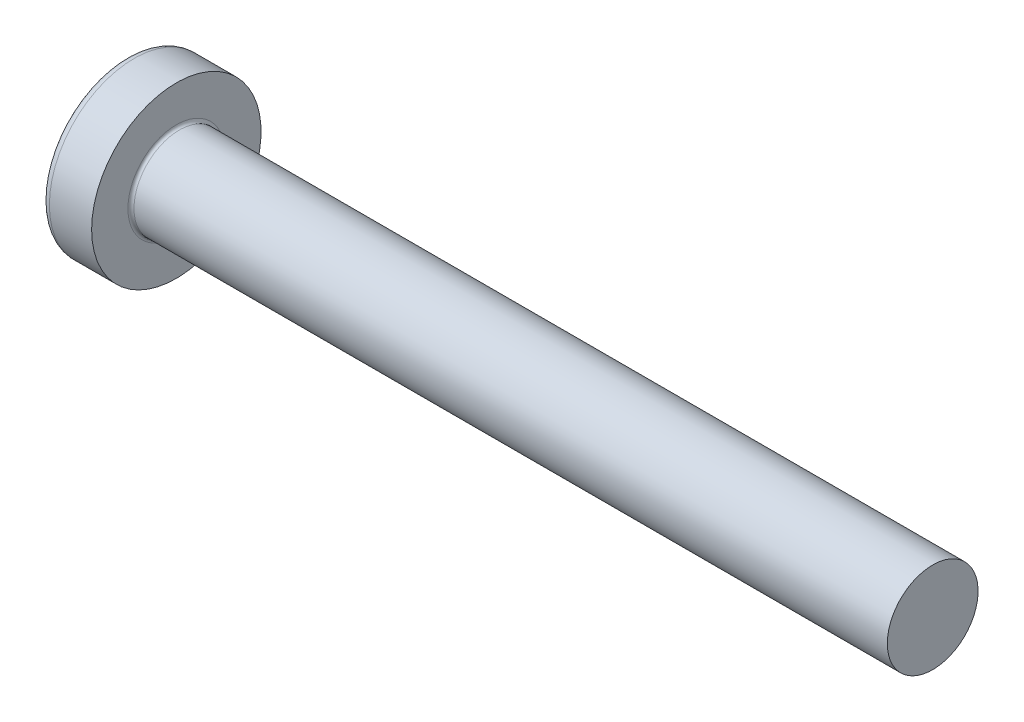
ISO-10303-21;
HEADER;
FILE_DESCRIPTION(('STEP AP214'),'2;1');
FILE_NAME('part.step','',(''),(''),'','','');
FILE_SCHEMA(('AUTOMOTIVE_DESIGN { 1 0 10303 214 1 1 1 1 }'));
ENDSEC;
DATA;
#1=APPLICATION_CONTEXT('core data for automotive mechanical design processes');
#2=APPLICATION_PROTOCOL_DEFINITION('international standard','automotive_design',2000,#1);
#3=PRODUCT_CONTEXT('',#1,'mechanical');
#4=PRODUCT('Part','Part','',(#3));
#5=PRODUCT_RELATED_PRODUCT_CATEGORY('part','',(#4));
#6=PRODUCT_DEFINITION_FORMATION('','',#4);
#7=PRODUCT_DEFINITION_CONTEXT('part definition',#1,'design');
#8=PRODUCT_DEFINITION('design','',#6,#7);
#9=PRODUCT_DEFINITION_SHAPE('','',#8);
#10=(LENGTH_UNIT() NAMED_UNIT(*) SI_UNIT(.MILLI.,.METRE.));
#11=(NAMED_UNIT(*) PLANE_ANGLE_UNIT() SI_UNIT($,.RADIAN.));
#12=(NAMED_UNIT(*) SI_UNIT($,.STERADIAN.) SOLID_ANGLE_UNIT());
#13=UNCERTAINTY_MEASURE_WITH_UNIT(LENGTH_MEASURE(1.E-05),#10,'distance_accuracy_value','');
#14=(GEOMETRIC_REPRESENTATION_CONTEXT(3) GLOBAL_UNCERTAINTY_ASSIGNED_CONTEXT((#13)) GLOBAL_UNIT_ASSIGNED_CONTEXT((#10,
#11,#12)) REPRESENTATION_CONTEXT('',''));
#15=CARTESIAN_POINT('',(0.,0.,0.));
#16=DIRECTION('',(0.,0.,1.));
#17=DIRECTION('',(1.,0.,0.));
#18=AXIS2_PLACEMENT_3D('',#15,#16,#17);
#19=CARTESIAN_POINT('',(5.,0.,0.));
#20=DIRECTION('',(-1.,0.,0.));
#21=DIRECTION('',(0.,1.,0.));
#22=AXIS2_PLACEMENT_3D('',#19,#20,#21);
#23=SPHERICAL_SURFACE('',#22,5.);
#24=CARTESIAN_POINT('',(0.775371598933733,0.,0.));
#25=DIRECTION('',(-1.,0.,0.));
#26=DIRECTION('',(0.,0.,1.));
#27=AXIS2_PLACEMENT_3D('',#24,#25,#26);
#28=CIRCLE('',#27,2.67441860465116);
#29=CARTESIAN_POINT('',(0.775371598933733,0.,2.67441860465116));
#30=VERTEX_POINT('',#29);
#31=EDGE_CURVE('E238',#30,#30,#28,.T.);
#32=ORIENTED_EDGE('',*,*,#31,.T.);
#33=EDGE_LOOP('',(#32));
#34=FACE_BOUND('',#33,.T.);
#35=CARTESIAN_POINT('',(0.0457951200896417,0.,0.));
#36=DIRECTION('',(1.,0.,0.));
#37=DIRECTION('',(0.,0.,-1.));
#38=AXIS2_PLACEMENT_3D('',#35,#36,#37);
#39=CIRCLE('',#38,0.675169614150692);
#40=CARTESIAN_POINT('',(0.0457951200896426,-0.369999999999997,-0.564760133040919));
#41=VERTEX_POINT('',#40);
#42=CARTESIAN_POINT('',(0.0457951200896417,-0.564760133040924,-0.37));
#43=VERTEX_POINT('',#42);
#44=EDGE_CURVE('E374',#41,#43,#39,.F.);
#45=ORIENTED_EDGE('',*,*,#44,.F.);
#46=CARTESIAN_POINT('',(5.,-0.370000000000002,0.));
#47=DIRECTION('',(0.,1.,0.));
#48=DIRECTION('',(0.,0.,1.));
#49=AXIS2_PLACEMENT_3D('',#46,#47,#48);
#50=CIRCLE('',#49,4.98629120689917);
#51=CARTESIAN_POINT('',(0.18786973422864,-0.369999999999995,-1.30633162146802));
#52=VERTEX_POINT('',#51);
#53=EDGE_CURVE('E300',#52,#41,#50,.T.);
#54=ORIENTED_EDGE('',*,*,#53,.F.);
#55=CARTESIAN_POINT('',(4.56358262530798,0.,0.87531798330592));
#56=DIRECTION('',(0.446197753347436,0.,-0.894934391398442));
#57=DIRECTION('',(-0.894934391398442,0.,-0.446197753347436));
#58=AXIS2_PLACEMENT_3D('',#55,#56,#57);
#59=CIRCLE('',#58,4.90340272700175);
#60=CARTESIAN_POINT('',(0.187869734228641,0.370000000000005,-1.30633162146802));
#61=VERTEX_POINT('',#60);
#62=EDGE_CURVE('E272',#52,#61,#59,.T.);
#63=ORIENTED_EDGE('',*,*,#62,.T.);
#64=CARTESIAN_POINT('',(5.,0.369999999999999,0.));
#65=DIRECTION('',(0.,-1.,0.));
#66=DIRECTION('',(0.,0.,-1.));
#67=AXIS2_PLACEMENT_3D('',#64,#65,#66);
#68=CIRCLE('',#67,4.98629120689917);
#69=CARTESIAN_POINT('',(0.0457951200896424,0.370000000000002,-0.564760133040916));
#70=VERTEX_POINT('',#69);
#71=EDGE_CURVE('E327',#70,#61,#68,.T.);
#72=ORIENTED_EDGE('',*,*,#71,.F.);
#73=CARTESIAN_POINT('',(0.0457951200896417,0.564760133040913,-0.37));
#74=VERTEX_POINT('',#73);
#75=EDGE_CURVE('E393',#74,#70,#39,.F.);
#76=ORIENTED_EDGE('',*,*,#75,.F.);
#77=CARTESIAN_POINT('',(5.,0.,-0.369999999999999));
#78=DIRECTION('',(0.,0.,1.));
#79=DIRECTION('',(1.,0.,0.));
#80=AXIS2_PLACEMENT_3D('',#77,#78,#79);
#81=CIRCLE('',#80,4.98629120689917);
#82=CARTESIAN_POINT('',(0.187869734228642,1.30633162146802,-0.37));
#83=VERTEX_POINT('',#82);
#84=EDGE_CURVE('E266',#83,#74,#81,.T.);
#85=ORIENTED_EDGE('',*,*,#84,.F.);
#86=CARTESIAN_POINT('',(4.56358262530798,-0.87531798330592,0.));
#87=DIRECTION('',(0.446197753347436,0.894934391398443,0.));
#88=DIRECTION('',(-0.894934391398443,0.446197753347436,0.));
#89=AXIS2_PLACEMENT_3D('',#86,#87,#88);
#90=CIRCLE('',#89,4.90340272700175);
#91=CARTESIAN_POINT('',(0.187869734228642,1.30633162146802,0.370000000000001));
#92=VERTEX_POINT('',#91);
#93=EDGE_CURVE('E269',#83,#92,#90,.T.);
#94=ORIENTED_EDGE('',*,*,#93,.T.);
#95=CARTESIAN_POINT('',(5.,0.,0.370000000000002));
#96=DIRECTION('',(0.,0.,-1.));
#97=DIRECTION('',(-1.,0.,0.));
#98=AXIS2_PLACEMENT_3D('',#95,#96,#97);
#99=CIRCLE('',#98,4.98629120689917);
#100=CARTESIAN_POINT('',(0.0457951200896417,0.564760133040909,0.369999999999999));
#101=VERTEX_POINT('',#100);
#102=EDGE_CURVE('E262',#101,#92,#99,.T.);
#103=ORIENTED_EDGE('',*,*,#102,.F.);
#104=CARTESIAN_POINT('',(0.0457951200896434,0.369999999999998,0.564760133040918));
#105=VERTEX_POINT('',#104);
#106=EDGE_CURVE('E427',#105,#101,#39,.F.);
#107=ORIENTED_EDGE('',*,*,#106,.F.);
#108=CARTESIAN_POINT('',(0.187869734228641,0.369999999999995,1.30633162146802));
#109=VERTEX_POINT('',#108);
#110=EDGE_CURVE('E282',#109,#105,#68,.T.);
#111=ORIENTED_EDGE('',*,*,#110,.F.);
#112=CARTESIAN_POINT('',(4.56358262530798,0.,-0.87531798330592));
#113=DIRECTION('',(0.446197753347436,0.,0.894934391398443));
#114=DIRECTION('',(0.894934391398443,0.,-0.446197753347436));
#115=AXIS2_PLACEMENT_3D('',#112,#113,#114);
#116=CIRCLE('',#115,4.90340272700175);
#117=CARTESIAN_POINT('',(0.18786973422864,-0.370000000000005,1.30633162146802));
#118=VERTEX_POINT('',#117);
#119=EDGE_CURVE('E49',#109,#118,#116,.T.);
#120=ORIENTED_EDGE('',*,*,#119,.T.);
#121=CARTESIAN_POINT('',(0.0457951200896421,-0.370000000000001,0.564760133040917));
#122=VERTEX_POINT('',#121);
#123=EDGE_CURVE('E279',#122,#118,#50,.T.);
#124=ORIENTED_EDGE('',*,*,#123,.F.);
#125=CARTESIAN_POINT('',(0.0457951200896417,-0.56476013304092,0.369999999999999));
#126=VERTEX_POINT('',#125);
#127=EDGE_CURVE('E392',#126,#122,#39,.F.);
#128=ORIENTED_EDGE('',*,*,#127,.F.);
#129=CARTESIAN_POINT('',(0.187869734228638,-1.30633162146802,0.369999999999999));
#130=VERTEX_POINT('',#129);
#131=EDGE_CURVE('E263',#130,#126,#99,.T.);
#132=ORIENTED_EDGE('',*,*,#131,.F.);
#133=CARTESIAN_POINT('',(4.56358262530798,0.875317983305919,0.));
#134=DIRECTION('',(0.446197753347436,-0.894934391398442,0.));
#135=DIRECTION('',(0.894934391398442,0.446197753347436,0.));
#136=AXIS2_PLACEMENT_3D('',#133,#134,#135);
#137=CIRCLE('',#136,4.90340272700175);
#138=CARTESIAN_POINT('',(0.187869734228638,-1.30633162146802,-0.37));
#139=VERTEX_POINT('',#138);
#140=EDGE_CURVE('E259',#130,#139,#137,.T.);
#141=ORIENTED_EDGE('',*,*,#140,.T.);
#142=EDGE_CURVE('E64',#43,#139,#81,.T.);
#143=ORIENTED_EDGE('',*,*,#142,.F.);
#144=EDGE_LOOP('',(#45,#54,#63,#72,#76,#85,#94,#103,#107,#111,#120,#124,#128,#132,#141,#143));
#145=FACE_BOUND('',#144,.T.);
#146=ADVANCED_FACE('F36',(#34,#145),#23,.T.);
#147=CARTESIAN_POINT('',(1.75,0.527482331818931,-0.37));
#148=DIRECTION('',(0.,0.,1.));
#149=DIRECTION('',(1.,0.,0.));
#150=AXIS2_PLACEMENT_3D('',#147,#148,#149);
#151=PLANE('',#150);
#152=ORIENTED_EDGE('',*,*,#84,.T.);
#153=CARTESIAN_POINT('',(-0.987293237069636,0.649401255968442,-0.37));
#154=CARTESIAN_POINT('',(-0.781914975331302,0.632865887004023,-0.37));
#155=CARTESIAN_POINT('',(-0.576547882405889,0.616188977636102,-0.37));
#156=CARTESIAN_POINT('',(-0.165841599235441,0.582441031964983,-0.37));
#157=CARTESIAN_POINT('',(0.0394975903016328,0.5653699870555,-0.37));
#158=CARTESIAN_POINT('',(0.4501334754206,0.530723441326706,-0.37));
#159=CARTESIAN_POINT('',(0.65543017101234,0.513147940624409,-0.37));
#160=CARTESIAN_POINT('',(1.06596140178858,0.477314957984981,-0.37));
#161=CARTESIAN_POINT('',(1.27119593782008,0.459057485804908,-0.37));
#162=CARTESIAN_POINT('',(1.61065292367297,0.428051938687225,-0.37));
#163=CARTESIAN_POINT('',(1.74490059997313,0.415580824989367,-0.37));
#164=CARTESIAN_POINT('',(2.01334321764434,0.390092023403371,-0.37));
#165=CARTESIAN_POINT('',(2.14753815936247,0.377074339175719,-0.37));
#166=CARTESIAN_POINT('',(2.41586354153627,0.350315629451146,-0.37));
#167=CARTESIAN_POINT('',(2.54999397846979,0.336574568175918,-0.37));
#168=CARTESIAN_POINT('',(2.8181417329714,0.308004077740054,-0.37));
#169=CARTESIAN_POINT('',(2.95215904766802,0.29317462174519,-0.37));
#170=CARTESIAN_POINT('',(3.08609550685347,0.277618485069874,-0.37));
#171=B_SPLINE_CURVE_WITH_KNOTS('',3,(#153,#154,#155,#156,#157,#158,#159,#160,#161,#162,#163,
#164,#165,#166,#167,#168,#169,#170),.UNSPECIFIED.,.F.,.F.,(4,2,2,2,2,2,2,2,4),(0.,
0.61812879398981,1.23627109813549,1.85441325889711,2.47254657920086,2.87702276221884,
3.28149623681437,3.68598973554218,4.09049321035586),.UNSPECIFIED.);
#172=CARTESIAN_POINT('',(1.75,0.415013252800437,-0.37));
#173=VERTEX_POINT('',#172);
#174=EDGE_CURVE('E414',#74,#173,#171,.T.);
#175=ORIENTED_EDGE('',*,*,#174,.T.);
#176=DIRECTION('',(0.,1.,0.));
#177=VECTOR('',#176,1.);
#178=CARTESIAN_POINT('',(1.75,-0.527482331818931,-0.37));
#179=LINE('',#178,#177);
#180=CARTESIAN_POINT('',(1.75,0.527482331818932,-0.37));
#181=VERTEX_POINT('',#180);
#182=EDGE_CURVE('E356',#173,#181,#179,.T.);
#183=ORIENTED_EDGE('',*,*,#182,.T.);
#184=DIRECTION('',(0.894934391398442,-0.446197753347436,0.));
#185=VECTOR('',#184,1.);
#186=CARTESIAN_POINT('',(0.,1.4,-0.37));
#187=LINE('',#186,#185);
#188=EDGE_CURVE('E239',#83,#181,#187,.T.);
#189=ORIENTED_EDGE('',*,*,#188,.F.);
#190=EDGE_LOOP('',(#152,#175,#183,#189));
#191=FACE_BOUND('',#190,.T.);
#192=ADVANCED_FACE('F194',(#191),#151,.T.);
#193=CARTESIAN_POINT('',(1.75,-0.527482331818931,-0.37));
#194=VERTEX_POINT('',#193);
#195=CARTESIAN_POINT('',(1.75,-0.415013252800437,-0.37));
#196=VERTEX_POINT('',#195);
#197=EDGE_CURVE('E247',#194,#196,#179,.T.);
#198=ORIENTED_EDGE('',*,*,#197,.T.);
#199=CARTESIAN_POINT('',(-0.987293237069636,-0.649401255968442,-0.37));
#200=CARTESIAN_POINT('',(-0.781914975331303,-0.632865887004023,-0.37));
#201=CARTESIAN_POINT('',(-0.57654788240589,-0.616188977636102,-0.37));
#202=CARTESIAN_POINT('',(-0.165841599235441,-0.582441031964983,-0.37));
#203=CARTESIAN_POINT('',(0.0394975903016326,-0.5653699870555,-0.37));
#204=CARTESIAN_POINT('',(0.4501334754206,-0.530723441326706,-0.37));
#205=CARTESIAN_POINT('',(0.65543017101234,-0.513147940624409,-0.37));
#206=CARTESIAN_POINT('',(1.06596140178858,-0.477314957984981,-0.37));
#207=CARTESIAN_POINT('',(1.27119593782008,-0.459057485804908,-0.37));
#208=CARTESIAN_POINT('',(1.61065292367297,-0.428051938687225,-0.37));
#209=CARTESIAN_POINT('',(1.74490059997313,-0.415580824989368,-0.37));
#210=CARTESIAN_POINT('',(2.01334321764433,-0.390092023403371,-0.37));
#211=CARTESIAN_POINT('',(2.14753815936247,-0.377074339175718,-0.37));
#212=CARTESIAN_POINT('',(2.41586354153627,-0.350315629451146,-0.37));
#213=CARTESIAN_POINT('',(2.54999397846979,-0.336574568175918,-0.37));
#214=CARTESIAN_POINT('',(2.8181417329714,-0.308004077740054,-0.37));
#215=CARTESIAN_POINT('',(2.95215904766802,-0.29317462174519,-0.37));
#216=CARTESIAN_POINT('',(3.08609550685347,-0.277618485069873,-0.37));
#217=B_SPLINE_CURVE_WITH_KNOTS('',3,(#199,#200,#201,#202,#203,#204,#205,#206,#207,#208,#209,
#210,#211,#212,#213,#214,#215,#216),.UNSPECIFIED.,.F.,.F.,(4,2,2,2,2,2,2,2,4),(0.,
0.61812879398981,1.2362710981355,1.85441325889711,2.47254657920086,2.87702276221884,
3.28149623681437,3.68598973554218,4.09049321035587),.UNSPECIFIED.);
#218=EDGE_CURVE('E391',#196,#43,#217,.F.);
#219=ORIENTED_EDGE('',*,*,#218,.T.);
#220=ORIENTED_EDGE('',*,*,#142,.T.);
#221=DIRECTION('',(0.894934391398442,0.446197753347436,0.));
#222=VECTOR('',#221,1.);
#223=CARTESIAN_POINT('',(0.,-1.4,-0.37));
#224=LINE('',#223,#222);
#225=EDGE_CURVE('E330',#139,#194,#224,.T.);
#226=ORIENTED_EDGE('',*,*,#225,.T.);
#227=EDGE_LOOP('',(#198,#219,#220,#226));
#228=FACE_BOUND('',#227,.T.);
#229=ADVANCED_FACE('F200',(#228),#151,.T.);
#230=CARTESIAN_POINT('',(1.75,-0.527482331818931,0.37));
#231=DIRECTION('',(0.,0.,-1.));
#232=DIRECTION('',(-1.,0.,0.));
#233=AXIS2_PLACEMENT_3D('',#230,#231,#232);
#234=PLANE('',#233);
#235=DIRECTION('',(0.,-1.,0.));
#236=VECTOR('',#235,1.);
#237=CARTESIAN_POINT('',(1.75,0.527482331818932,0.37));
#238=LINE('',#237,#236);
#239=CARTESIAN_POINT('',(1.75,0.527482331818932,0.37));
#240=VERTEX_POINT('',#239);
#241=CARTESIAN_POINT('',(1.75,0.415013252800437,0.37));
#242=VERTEX_POINT('',#241);
#243=EDGE_CURVE('E339',#240,#242,#238,.T.);
#244=ORIENTED_EDGE('',*,*,#243,.T.);
#245=CARTESIAN_POINT('',(-0.987293237053716,0.649401255967162,0.369999999999998));
#246=CARTESIAN_POINT('',(-0.781914975317084,0.632865887002872,0.369999999999998));
#247=CARTESIAN_POINT('',(-0.576547882393372,0.616188977635082,0.369999999999998));
#248=CARTESIAN_POINT('',(-0.165841599226327,0.582441031964228,0.369999999999999));
#249=CARTESIAN_POINT('',(0.0394975903090454,0.56536998705488,0.369999999999999));
#250=CARTESIAN_POINT('',(0.450133475422573,0.530723441326535,0.369999999999999));
#251=CARTESIAN_POINT('',(0.655430171010574,0.513147940624557,0.369999999999999));
#252=CARTESIAN_POINT('',(1.06596140177934,0.477314957985794,0.37));
#253=CARTESIAN_POINT('',(1.2711959378071,0.459057485806066,0.37));
#254=CARTESIAN_POINT('',(1.61065292365626,0.428051938688769,0.37));
#255=CARTESIAN_POINT('',(1.74490059995643,0.415580824990931,0.37));
#256=CARTESIAN_POINT('',(2.01334321762763,0.390092023404979,0.37));
#257=CARTESIAN_POINT('',(2.14753815934577,0.377074339177353,0.37));
#258=CARTESIAN_POINT('',(2.41586354151957,0.350315629452842,0.37));
#259=CARTESIAN_POINT('',(2.5499939784531,0.33657456817765,0.370000000000001));
#260=CARTESIAN_POINT('',(2.81814173295471,0.308004077741874,0.370000000000001));
#261=CARTESIAN_POINT('',(2.95215904765134,0.293174621747064,0.370000000000001));
#262=CARTESIAN_POINT('',(3.0860955068368,0.277618485071814,0.370000000000001));
#263=B_SPLINE_CURVE_WITH_KNOTS('',3,(#245,#246,#247,#248,#249,#250,#251,#252,#253,#254,#255,
#256,#257,#258,#259,#260,#261,#262),.UNSPECIFIED.,.F.,.F.,(4,2,2,2,2,2,2,2,4),(0.,
0.618128793984691,1.23627109812526,1.85441325887562,2.4725465791681,2.87702276218609,
3.28149623678161,3.68598973550942,4.09049321032311),.UNSPECIFIED.);
#264=EDGE_CURVE('E428',#242,#101,#263,.F.);
#265=ORIENTED_EDGE('',*,*,#264,.T.);
#266=ORIENTED_EDGE('',*,*,#102,.T.);
#267=DIRECTION('',(0.894934391398442,-0.446197753347436,0.));
#268=VECTOR('',#267,1.);
#269=CARTESIAN_POINT('',(0.,1.4,0.37));
#270=LINE('',#269,#268);
#271=EDGE_CURVE('E244',#92,#240,#270,.T.);
#272=ORIENTED_EDGE('',*,*,#271,.T.);
#273=EDGE_LOOP('',(#244,#265,#266,#272));
#274=FACE_BOUND('',#273,.T.);
#275=ADVANCED_FACE('F410',(#274),#234,.T.);
#276=ORIENTED_EDGE('',*,*,#131,.T.);
#277=CARTESIAN_POINT('',(-0.987293237053716,-0.649401255967162,0.369999999999998));
#278=CARTESIAN_POINT('',(-0.781914975317084,-0.632865887002872,0.369999999999998));
#279=CARTESIAN_POINT('',(-0.576547882393373,-0.616188977635082,0.369999999999999));
#280=CARTESIAN_POINT('',(-0.165841599226327,-0.582441031964228,0.369999999999999));
#281=CARTESIAN_POINT('',(0.0394975903090454,-0.56536998705488,0.369999999999999));
#282=CARTESIAN_POINT('',(0.450133475422572,-0.530723441326535,0.369999999999999));
#283=CARTESIAN_POINT('',(0.655430171010573,-0.513147940624557,0.369999999999999));
#284=CARTESIAN_POINT('',(1.06596140177934,-0.477314957985794,0.37));
#285=CARTESIAN_POINT('',(1.2711959378071,-0.459057485806066,0.37));
#286=CARTESIAN_POINT('',(1.61065292365626,-0.428051938688769,0.37));
#287=CARTESIAN_POINT('',(1.74490059995643,-0.415580824990931,0.37));
#288=CARTESIAN_POINT('',(2.01334321762763,-0.390092023404979,0.37));
#289=CARTESIAN_POINT('',(2.14753815934577,-0.377074339177353,0.37));
#290=CARTESIAN_POINT('',(2.41586354151957,-0.350315629452842,0.370000000000001));
#291=CARTESIAN_POINT('',(2.5499939784531,-0.336574568177649,0.370000000000001));
#292=CARTESIAN_POINT('',(2.81814173295471,-0.308004077741874,0.370000000000001));
#293=CARTESIAN_POINT('',(2.95215904765134,-0.293174621747064,0.370000000000001));
#294=CARTESIAN_POINT('',(3.0860955068368,-0.277618485071814,0.370000000000001));
#295=B_SPLINE_CURVE_WITH_KNOTS('',3,(#277,#278,#279,#280,#281,#282,#283,#284,#285,#286,#287,
#288,#289,#290,#291,#292,#293,#294),.UNSPECIFIED.,.F.,.F.,(4,2,2,2,2,2,2,2,4),(0.,
0.618128793984691,1.23627109812525,1.85441325887562,2.4725465791681,2.87702276218609,
3.28149623678161,3.68598973550942,4.09049321032311),.UNSPECIFIED.);
#296=CARTESIAN_POINT('',(1.75,-0.415013252800437,0.370000000000001));
#297=VERTEX_POINT('',#296);
#298=EDGE_CURVE('E447',#126,#297,#295,.T.);
#299=ORIENTED_EDGE('',*,*,#298,.T.);
#300=CARTESIAN_POINT('',(1.75,-0.527482331818931,0.37));
#301=VERTEX_POINT('',#300);
#302=EDGE_CURVE('E341',#297,#301,#238,.T.);
#303=ORIENTED_EDGE('',*,*,#302,.T.);
#304=DIRECTION('',(0.894934391398442,0.446197753347436,0.));
#305=VECTOR('',#304,1.);
#306=CARTESIAN_POINT('',(0.,-1.4,0.369999999999999));
#307=LINE('',#306,#305);
#308=EDGE_CURVE('E332',#130,#301,#307,.T.);
#309=ORIENTED_EDGE('',*,*,#308,.F.);
#310=EDGE_LOOP('',(#276,#299,#303,#309));
#311=FACE_BOUND('',#310,.T.);
#312=ADVANCED_FACE('F508',(#311),#234,.T.);
#313=CARTESIAN_POINT('',(1.75,0.527482331818932,0.37));
#314=DIRECTION('',(0.446197753347436,0.894934391398443,0.));
#315=DIRECTION('',(-0.894934391398443,0.446197753347436,0.));
#316=AXIS2_PLACEMENT_3D('',#313,#314,#315);
#317=PLANE('',#316);
#318=CARTESIAN_POINT('',(2.6696526882832,0.0689604923233248,0.));
#319=DIRECTION('',(0.446197753347436,0.894934391398443,0.));
#320=DIRECTION('',(-0.894934391398443,0.446197753347436,0.));
#321=AXIS2_PLACEMENT_3D('',#318,#319,#320);
#322=ELLIPSE('',#321,1.10195897609154,0.486831694838766);
#323=CARTESIAN_POINT('',(1.75,0.527482331818932,0.175779377683681));
#324=VERTEX_POINT('',#323);
#325=CARTESIAN_POINT('',(1.75,0.527482331818932,-0.175779377683681));
#326=VERTEX_POINT('',#325);
#327=EDGE_CURVE('E305',#324,#326,#322,.F.);
#328=ORIENTED_EDGE('',*,*,#327,.F.);
#329=DIRECTION('',(0.,0.,-1.));
#330=VECTOR('',#329,1.);
#331=CARTESIAN_POINT('',(1.75,0.527482331818932,0.37));
#332=LINE('',#331,#330);
#333=EDGE_CURVE('E342',#240,#324,#332,.T.);
#334=ORIENTED_EDGE('',*,*,#333,.F.);
#335=ORIENTED_EDGE('',*,*,#271,.F.);
#336=ORIENTED_EDGE('',*,*,#93,.F.);
#337=ORIENTED_EDGE('',*,*,#188,.T.);
#338=EDGE_CURVE('E344',#326,#181,#332,.T.);
#339=ORIENTED_EDGE('',*,*,#338,.F.);
#340=EDGE_LOOP('',(#328,#334,#335,#336,#337,#339));
#341=FACE_BOUND('',#340,.T.);
#342=ADVANCED_FACE('F408',(#341),#317,.F.);
#343=CARTESIAN_POINT('',(1.75,-0.527482331818931,-0.37));
#344=DIRECTION('',(0.446197753347436,-0.894934391398442,0.));
#345=DIRECTION('',(0.894934391398442,0.446197753347436,0.));
#346=AXIS2_PLACEMENT_3D('',#343,#344,#345);
#347=PLANE('',#346);
#348=CARTESIAN_POINT('',(2.6696526882832,-0.0689604923233258,0.));
#349=DIRECTION('',(0.446197753347436,-0.894934391398442,0.));
#350=DIRECTION('',(-0.894934391398442,-0.446197753347436,0.));
#351=AXIS2_PLACEMENT_3D('',#348,#349,#350);
#352=ELLIPSE('',#351,1.10195897609153,0.486831694838766);
#353=CARTESIAN_POINT('',(1.75,-0.527482331818932,-0.175779377683682));
#354=VERTEX_POINT('',#353);
#355=CARTESIAN_POINT('',(1.75,-0.527482331818932,0.175779377683682));
#356=VERTEX_POINT('',#355);
#357=EDGE_CURVE('E452',#354,#356,#352,.F.);
#358=ORIENTED_EDGE('',*,*,#357,.F.);
#359=DIRECTION('',(0.,0.,1.));
#360=VECTOR('',#359,1.);
#361=CARTESIAN_POINT('',(1.75,-0.527482331818931,-0.37));
#362=LINE('',#361,#360);
#363=EDGE_CURVE('E335',#194,#354,#362,.T.);
#364=ORIENTED_EDGE('',*,*,#363,.F.);
#365=ORIENTED_EDGE('',*,*,#225,.F.);
#366=ORIENTED_EDGE('',*,*,#140,.F.);
#367=ORIENTED_EDGE('',*,*,#308,.T.);
#368=EDGE_CURVE('E338',#356,#301,#362,.T.);
#369=ORIENTED_EDGE('',*,*,#368,.F.);
#370=EDGE_LOOP('',(#358,#364,#365,#366,#367,#369));
#371=FACE_BOUND('',#370,.T.);
#372=ADVANCED_FACE('F500',(#371),#347,.F.);
#373=CARTESIAN_POINT('',(1.75,-0.527482331818931,-0.37));
#374=DIRECTION('',(1.,0.,0.));
#375=DIRECTION('',(0.,0.,-1.));
#376=AXIS2_PLACEMENT_3D('',#373,#374,#375);
#377=PLANE('',#376);
#378=CARTESIAN_POINT('',(1.75,0.,0.));
#379=DIRECTION('',(-1.,0.,0.));
#380=DIRECTION('',(0.,0.,1.));
#381=AXIS2_PLACEMENT_3D('',#378,#379,#380);
#382=CIRCLE('',#381,0.556);
#383=CARTESIAN_POINT('',(1.75,-0.175779377683682,-0.527482331818932));
#384=VERTEX_POINT('',#383);
#385=CARTESIAN_POINT('',(1.75,-0.369999999999999,-0.415013252800438));
#386=VERTEX_POINT('',#385);
#387=EDGE_CURVE('E56',#384,#386,#382,.T.);
#388=ORIENTED_EDGE('',*,*,#387,.F.);
#389=DIRECTION('',(0.,-1.,0.));
#390=VECTOR('',#389,1.);
#391=CARTESIAN_POINT('',(1.75,0.370000000000002,-0.52748233181893));
#392=LINE('',#391,#390);
#393=CARTESIAN_POINT('',(1.75,-0.369999999999998,-0.527482331818932));
#394=VERTEX_POINT('',#393);
#395=EDGE_CURVE('E315',#384,#394,#392,.T.);
#396=ORIENTED_EDGE('',*,*,#395,.T.);
#397=DIRECTION('',(0.,0.,-1.));
#398=VECTOR('',#397,1.);
#399=CARTESIAN_POINT('',(1.75,-0.370000000000002,0.52748233181893));
#400=LINE('',#399,#398);
#401=EDGE_CURVE('E319',#386,#394,#400,.T.);
#402=ORIENTED_EDGE('',*,*,#401,.F.);
#403=EDGE_LOOP('',(#388,#396,#402));
#404=FACE_BOUND('',#403,.T.);
#405=ADVANCED_FACE('F380',(#404),#377,.F.);
#406=EDGE_CURVE('E385',#196,#354,#382,.T.);
#407=ORIENTED_EDGE('',*,*,#406,.F.);
#408=ORIENTED_EDGE('',*,*,#197,.F.);
#409=ORIENTED_EDGE('',*,*,#363,.T.);
#410=EDGE_LOOP('',(#407,#408,#409));
#411=FACE_BOUND('',#410,.T.);
#412=ADVANCED_FACE('F507',(#411),#377,.F.);
#413=EDGE_CURVE('E515',#356,#297,#382,.T.);
#414=ORIENTED_EDGE('',*,*,#413,.F.);
#415=ORIENTED_EDGE('',*,*,#368,.T.);
#416=ORIENTED_EDGE('',*,*,#302,.F.);
#417=EDGE_LOOP('',(#414,#415,#416));
#418=FACE_BOUND('',#417,.T.);
#419=ADVANCED_FACE('F496',(#418),#377,.F.);
#420=CARTESIAN_POINT('',(1.75,-0.370000000000001,0.415013252800436));
#421=VERTEX_POINT('',#420);
#422=CARTESIAN_POINT('',(1.75,-0.175779377683684,0.527482331818931));
#423=VERTEX_POINT('',#422);
#424=EDGE_CURVE('E483',#421,#423,#382,.T.);
#425=ORIENTED_EDGE('',*,*,#424,.F.);
#426=CARTESIAN_POINT('',(1.75,-0.370000000000002,0.52748233181893));
#427=VERTEX_POINT('',#426);
#428=EDGE_CURVE('E316',#427,#421,#400,.T.);
#429=ORIENTED_EDGE('',*,*,#428,.F.);
#430=DIRECTION('',(0.,1.,0.));
#431=VECTOR('',#430,1.);
#432=CARTESIAN_POINT('',(1.75,-0.370000000000002,0.52748233181893));
#433=LINE('',#432,#431);
#434=EDGE_CURVE('E320',#427,#423,#433,.T.);
#435=ORIENTED_EDGE('',*,*,#434,.T.);
#436=EDGE_LOOP('',(#425,#429,#435));
#437=FACE_BOUND('',#436,.T.);
#438=ADVANCED_FACE('F481',(#437),#377,.F.);
#439=CARTESIAN_POINT('',(1.75,0.175779377683681,0.527482331818932));
#440=VERTEX_POINT('',#439);
#441=CARTESIAN_POINT('',(1.75,0.369999999999998,0.415013252800439));
#442=VERTEX_POINT('',#441);
#443=EDGE_CURVE('E386',#440,#442,#382,.T.);
#444=ORIENTED_EDGE('',*,*,#443,.F.);
#445=CARTESIAN_POINT('',(1.75,0.369999999999998,0.527482331818933));
#446=VERTEX_POINT('',#445);
#447=EDGE_CURVE('E323',#440,#446,#433,.T.);
#448=ORIENTED_EDGE('',*,*,#447,.T.);
#449=DIRECTION('',(0.,0.,1.));
#450=VECTOR('',#449,1.);
#451=CARTESIAN_POINT('',(1.75,0.370000000000002,-0.52748233181893));
#452=LINE('',#451,#450);
#453=EDGE_CURVE('E297',#442,#446,#452,.T.);
#454=ORIENTED_EDGE('',*,*,#453,.F.);
#455=EDGE_LOOP('',(#444,#448,#454));
#456=FACE_BOUND('',#455,.T.);
#457=ADVANCED_FACE('F489',(#456),#377,.F.);
#458=EDGE_CURVE('E466',#242,#324,#382,.T.);
#459=ORIENTED_EDGE('',*,*,#458,.F.);
#460=ORIENTED_EDGE('',*,*,#243,.F.);
#461=ORIENTED_EDGE('',*,*,#333,.T.);
#462=EDGE_LOOP('',(#459,#460,#461));
#463=FACE_BOUND('',#462,.T.);
#464=ADVANCED_FACE('F491',(#463),#377,.F.);
#465=EDGE_CURVE('E464',#326,#173,#382,.T.);
#466=ORIENTED_EDGE('',*,*,#465,.F.);
#467=ORIENTED_EDGE('',*,*,#338,.T.);
#468=ORIENTED_EDGE('',*,*,#182,.F.);
#469=EDGE_LOOP('',(#466,#467,#468));
#470=FACE_BOUND('',#469,.T.);
#471=ADVANCED_FACE('F438',(#470),#377,.F.);
#472=CARTESIAN_POINT('',(1.75,-0.369999999999998,-0.527482331818932));
#473=DIRECTION('',(0.,1.,0.));
#474=DIRECTION('',(-1.,0.,0.));
#475=AXIS2_PLACEMENT_3D('',#472,#473,#474);
#476=PLANE('',#475);
#477=ORIENTED_EDGE('',*,*,#428,.T.);
#478=CARTESIAN_POINT('',(-0.987293237069635,-0.37,0.649401255968442));
#479=CARTESIAN_POINT('',(-0.781914975331302,-0.37,0.632865887004023));
#480=CARTESIAN_POINT('',(-0.576547882405888,-0.370000000000001,0.616188977636102));
#481=CARTESIAN_POINT('',(-0.16584159923544,-0.370000000000001,0.582441031964982));
#482=CARTESIAN_POINT('',(0.0394975903016338,-0.370000000000001,0.565369987055499));
#483=CARTESIAN_POINT('',(0.450133475420601,-0.370000000000001,0.530723441326705));
#484=CARTESIAN_POINT('',(0.655430171012341,-0.370000000000001,0.513147940624408));
#485=CARTESIAN_POINT('',(1.06596140178858,-0.370000000000001,0.47731495798498));
#486=CARTESIAN_POINT('',(1.27119593782008,-0.370000000000001,0.459057485804906));
#487=CARTESIAN_POINT('',(1.61065292367297,-0.370000000000001,0.428051938687223));
#488=CARTESIAN_POINT('',(1.74490059997313,-0.370000000000001,0.415580824989366));
#489=CARTESIAN_POINT('',(2.01334321764434,-0.370000000000002,0.390092023403369));
#490=CARTESIAN_POINT('',(2.14753815936247,-0.370000000000002,0.377074339175717));
#491=CARTESIAN_POINT('',(2.41586354153627,-0.370000000000002,0.350315629451144));
#492=CARTESIAN_POINT('',(2.54999397846979,-0.370000000000002,0.336574568175916));
#493=CARTESIAN_POINT('',(2.8181417329714,-0.370000000000002,0.308004077740052));
#494=CARTESIAN_POINT('',(2.95215904766802,-0.370000000000002,0.293174621745187));
#495=CARTESIAN_POINT('',(3.08609550685347,-0.370000000000002,0.277618485069871));
#496=B_SPLINE_CURVE_WITH_KNOTS('',3,(#478,#479,#480,#481,#482,#483,#484,#485,#486,#487,#488,
#489,#490,#491,#492,#493,#494,#495),.UNSPECIFIED.,.F.,.F.,(4,2,2,2,2,2,2,2,4),(0.,
0.61812879398981,1.23627109813549,1.85441325889711,2.47254657920086,2.87702276221884,
3.28149623681436,3.68598973554217,4.09049321035586),.UNSPECIFIED.);
#497=EDGE_CURVE('E441',#421,#122,#496,.F.);
#498=ORIENTED_EDGE('',*,*,#497,.T.);
#499=ORIENTED_EDGE('',*,*,#123,.T.);
#500=DIRECTION('',(0.894934391398442,0.,-0.446197753347436));
#501=VECTOR('',#500,1.);
#502=CARTESIAN_POINT('',(0.,-0.370000000000004,1.4));
#503=LINE('',#502,#501);
#504=EDGE_CURVE('E292',#118,#427,#503,.T.);
#505=ORIENTED_EDGE('',*,*,#504,.T.);
#506=EDGE_LOOP('',(#477,#498,#499,#505));
#507=FACE_BOUND('',#506,.T.);
#508=ADVANCED_FACE('F229',(#507),#476,.T.);
#509=CARTESIAN_POINT('',(1.75,0.369999999999998,0.527482331818933));
#510=DIRECTION('',(0.,-1.,0.));
#511=DIRECTION('',(1.,0.,0.));
#512=AXIS2_PLACEMENT_3D('',#509,#510,#511);
#513=PLANE('',#512);
#514=ORIENTED_EDGE('',*,*,#110,.T.);
#515=CARTESIAN_POINT('',(-0.987293237069635,0.369999999999998,0.649401255968443));
#516=CARTESIAN_POINT('',(-0.781914975331301,0.369999999999998,0.632865887004024));
#517=CARTESIAN_POINT('',(-0.576547882405888,0.369999999999998,0.616188977636103));
#518=CARTESIAN_POINT('',(-0.16584159923544,0.369999999999998,0.582441031964984));
#519=CARTESIAN_POINT('',(0.0394975903016335,0.369999999999998,0.565369987055501));
#520=CARTESIAN_POINT('',(0.450133475420601,0.369999999999998,0.530723441326707));
#521=CARTESIAN_POINT('',(0.655430171012341,0.369999999999998,0.51314794062441));
#522=CARTESIAN_POINT('',(1.06596140178858,0.369999999999998,0.477314957984982));
#523=CARTESIAN_POINT('',(1.27119593782008,0.369999999999998,0.459057485804909));
#524=CARTESIAN_POINT('',(1.61065292367297,0.369999999999998,0.428051938687226));
#525=CARTESIAN_POINT('',(1.74490059997313,0.369999999999998,0.415580824989369));
#526=CARTESIAN_POINT('',(2.01334321764434,0.369999999999998,0.390092023403372));
#527=CARTESIAN_POINT('',(2.14753815936247,0.369999999999998,0.37707433917572));
#528=CARTESIAN_POINT('',(2.41586354153627,0.369999999999999,0.350315629451147));
#529=CARTESIAN_POINT('',(2.54999397846979,0.369999999999999,0.336574568175919));
#530=CARTESIAN_POINT('',(2.8181417329714,0.369999999999999,0.308004077740055));
#531=CARTESIAN_POINT('',(2.95215904766802,0.369999999999999,0.293174621745191));
#532=CARTESIAN_POINT('',(3.08609550685347,0.369999999999999,0.277618485069875));
#533=B_SPLINE_CURVE_WITH_KNOTS('',3,(#515,#516,#517,#518,#519,#520,#521,#522,#523,#524,#525,
#526,#527,#528,#529,#530,#531,#532),.UNSPECIFIED.,.F.,.F.,(4,2,2,2,2,2,2,2,4),(0.,
0.61812879398981,1.23627109813549,1.85441325889711,2.47254657920086,2.87702276221884,
3.28149623681436,3.68598973554218,4.09049321035586),.UNSPECIFIED.);
#534=EDGE_CURVE('E422',#105,#442,#533,.T.);
#535=ORIENTED_EDGE('',*,*,#534,.T.);
#536=ORIENTED_EDGE('',*,*,#453,.T.);
#537=DIRECTION('',(0.894934391398442,0.,-0.446197753347436));
#538=VECTOR('',#537,1.);
#539=CARTESIAN_POINT('',(0.,0.369999999999995,1.4));
#540=LINE('',#539,#538);
#541=EDGE_CURVE('E290',#109,#446,#540,.T.);
#542=ORIENTED_EDGE('',*,*,#541,.F.);
#543=EDGE_LOOP('',(#514,#535,#536,#542));
#544=FACE_BOUND('',#543,.T.);
#545=ADVANCED_FACE('F294',(#544),#513,.T.);
#546=CARTESIAN_POINT('',(1.75,-0.370000000000002,0.52748233181893));
#547=DIRECTION('',(0.446197753347436,0.,0.894934391398443));
#548=DIRECTION('',(-0.894934391398443,0.,0.446197753347436));
#549=AXIS2_PLACEMENT_3D('',#546,#547,#548);
#550=PLANE('',#549);
#551=CARTESIAN_POINT('',(2.6696526882832,0.,0.0689604923233248));
#552=DIRECTION('',(0.446197753347436,0.,0.894934391398443));
#553=DIRECTION('',(-0.894934391398443,0.,0.446197753347436));
#554=AXIS2_PLACEMENT_3D('',#551,#552,#553);
#555=ELLIPSE('',#554,1.10195897609154,0.486831694838766);
#556=EDGE_CURVE('E420',#423,#440,#555,.F.);
#557=ORIENTED_EDGE('',*,*,#556,.F.);
#558=ORIENTED_EDGE('',*,*,#434,.F.);
#559=ORIENTED_EDGE('',*,*,#504,.F.);
#560=ORIENTED_EDGE('',*,*,#119,.F.);
#561=ORIENTED_EDGE('',*,*,#541,.T.);
#562=ORIENTED_EDGE('',*,*,#447,.F.);
#563=EDGE_LOOP('',(#557,#558,#559,#560,#561,#562));
#564=FACE_BOUND('',#563,.T.);
#565=ADVANCED_FACE('F288',(#564),#550,.F.);
#566=CARTESIAN_POINT('',(1.75,0.370000000000002,-0.52748233181893));
#567=DIRECTION('',(0.446197753347436,0.,-0.894934391398442));
#568=DIRECTION('',(0.894934391398442,0.,0.446197753347436));
#569=AXIS2_PLACEMENT_3D('',#566,#567,#568);
#570=PLANE('',#569);
#571=CARTESIAN_POINT('',(2.6696526882832,0.,-0.0689604923233258));
#572=DIRECTION('',(0.446197753347436,0.,-0.894934391398442));
#573=DIRECTION('',(-0.894934391398442,0.,-0.446197753347436));
#574=AXIS2_PLACEMENT_3D('',#571,#572,#573);
#575=ELLIPSE('',#574,1.10195897609153,0.486831694838766);
#576=CARTESIAN_POINT('',(1.75,0.175779377683686,-0.52748233181893));
#577=VERTEX_POINT('',#576);
#578=EDGE_CURVE('E378',#577,#384,#575,.F.);
#579=ORIENTED_EDGE('',*,*,#578,.F.);
#580=CARTESIAN_POINT('',(1.75,0.370000000000002,-0.52748233181893));
#581=VERTEX_POINT('',#580);
#582=EDGE_CURVE('E312',#581,#577,#392,.T.);
#583=ORIENTED_EDGE('',*,*,#582,.F.);
#584=DIRECTION('',(0.894934391398442,0.,0.446197753347436));
#585=VECTOR('',#584,1.);
#586=CARTESIAN_POINT('',(0.,0.370000000000005,-1.4));
#587=LINE('',#586,#585);
#588=EDGE_CURVE('E302',#61,#581,#587,.T.);
#589=ORIENTED_EDGE('',*,*,#588,.F.);
#590=ORIENTED_EDGE('',*,*,#62,.F.);
#591=DIRECTION('',(0.894934391398442,0.,0.446197753347436));
#592=VECTOR('',#591,1.);
#593=CARTESIAN_POINT('',(0.,-0.369999999999994,-1.4));
#594=LINE('',#593,#592);
#595=EDGE_CURVE('E309',#52,#394,#594,.T.);
#596=ORIENTED_EDGE('',*,*,#595,.T.);
#597=ORIENTED_EDGE('',*,*,#395,.F.);
#598=EDGE_LOOP('',(#579,#583,#589,#590,#596,#597));
#599=FACE_BOUND('',#598,.T.);
#600=ADVANCED_FACE('F369',(#599),#570,.F.);
#601=CARTESIAN_POINT('',(1.75,0.370000000000001,-0.415013252800436));
#602=VERTEX_POINT('',#601);
#603=EDGE_CURVE('E324',#581,#602,#452,.T.);
#604=ORIENTED_EDGE('',*,*,#603,.T.);
#605=CARTESIAN_POINT('',(-0.987293237053717,0.370000000000003,-0.649401255967159));
#606=CARTESIAN_POINT('',(-0.781914975317085,0.370000000000003,-0.63286588700287));
#607=CARTESIAN_POINT('',(-0.576547882393373,0.370000000000003,-0.616188977635079));
#608=CARTESIAN_POINT('',(-0.165841599226328,0.370000000000002,-0.582441031964225));
#609=CARTESIAN_POINT('',(0.0394975903090446,0.370000000000002,-0.565369987054878));
#610=CARTESIAN_POINT('',(0.450133475422571,0.370000000000002,-0.530723441326534));
#611=CARTESIAN_POINT('',(0.655430171010572,0.370000000000002,-0.513147940624555));
#612=CARTESIAN_POINT('',(1.06596140177934,0.370000000000002,-0.477314957985792));
#613=CARTESIAN_POINT('',(1.2711959378071,0.370000000000002,-0.459057485806065));
#614=CARTESIAN_POINT('',(1.61065292365626,0.370000000000001,-0.428051938688767));
#615=CARTESIAN_POINT('',(1.74490059995642,0.370000000000001,-0.415580824990929));
#616=CARTESIAN_POINT('',(2.01334321762763,0.370000000000001,-0.390092023404978));
#617=CARTESIAN_POINT('',(2.14753815934577,0.370000000000001,-0.377074339177352));
#618=CARTESIAN_POINT('',(2.41586354151957,0.370000000000001,-0.350315629452841));
#619=CARTESIAN_POINT('',(2.5499939784531,0.370000000000001,-0.336574568177649));
#620=CARTESIAN_POINT('',(2.81814173295471,0.370000000000001,-0.308004077741874));
#621=CARTESIAN_POINT('',(2.95215904765134,0.370000000000001,-0.293174621747064));
#622=CARTESIAN_POINT('',(3.0860955068368,0.370000000000001,-0.277618485071815));
#623=B_SPLINE_CURVE_WITH_KNOTS('',3,(#605,#606,#607,#608,#609,#610,#611,#612,#613,#614,#615,
#616,#617,#618,#619,#620,#621,#622),.UNSPECIFIED.,.F.,.F.,(4,2,2,2,2,2,2,2,4),(0.,
0.618128793984691,1.23627109812525,1.85441325887562,2.4725465791681,2.87702276218609,
3.28149623678161,3.68598973550942,4.09049321032311),.UNSPECIFIED.);
#624=EDGE_CURVE('E365',#602,#70,#623,.F.);
#625=ORIENTED_EDGE('',*,*,#624,.T.);
#626=ORIENTED_EDGE('',*,*,#71,.T.);
#627=ORIENTED_EDGE('',*,*,#588,.T.);
#628=EDGE_LOOP('',(#604,#625,#626,#627));
#629=FACE_BOUND('',#628,.T.);
#630=ADVANCED_FACE('F227',(#629),#513,.T.);
#631=ORIENTED_EDGE('',*,*,#53,.T.);
#632=CARTESIAN_POINT('',(-0.987293237053718,-0.369999999999996,-0.649401255967163));
#633=CARTESIAN_POINT('',(-0.781914975317086,-0.369999999999996,-0.632865887002874));
#634=CARTESIAN_POINT('',(-0.576547882393374,-0.369999999999996,-0.616188977635083));
#635=CARTESIAN_POINT('',(-0.165841599226328,-0.369999999999997,-0.582441031964229));
#636=CARTESIAN_POINT('',(0.0394975903090439,-0.369999999999997,-0.565369987054882));
#637=CARTESIAN_POINT('',(0.450133475422571,-0.369999999999997,-0.530723441326537));
#638=CARTESIAN_POINT('',(0.655430171010572,-0.369999999999998,-0.513147940624559));
#639=CARTESIAN_POINT('',(1.06596140177933,-0.369999999999998,-0.477314957985796));
#640=CARTESIAN_POINT('',(1.2711959378071,-0.369999999999998,-0.459057485806068));
#641=CARTESIAN_POINT('',(1.61065292365626,-0.369999999999998,-0.42805193868877));
#642=CARTESIAN_POINT('',(1.74490059995642,-0.369999999999999,-0.415580824990932));
#643=CARTESIAN_POINT('',(2.01334321762763,-0.369999999999999,-0.39009202340498));
#644=CARTESIAN_POINT('',(2.14753815934577,-0.369999999999999,-0.377074339177354));
#645=CARTESIAN_POINT('',(2.41586354151957,-0.369999999999999,-0.350315629452843));
#646=CARTESIAN_POINT('',(2.5499939784531,-0.369999999999999,-0.336574568177651));
#647=CARTESIAN_POINT('',(2.81814173295471,-0.37,-0.308004077741875));
#648=CARTESIAN_POINT('',(2.95215904765134,-0.37,-0.293174621747065));
#649=CARTESIAN_POINT('',(3.0860955068368,-0.37,-0.277618485071816));
#650=B_SPLINE_CURVE_WITH_KNOTS('',3,(#632,#633,#634,#635,#636,#637,#638,#639,#640,#641,#642,
#643,#644,#645,#646,#647,#648,#649),.UNSPECIFIED.,.F.,.F.,(4,2,2,2,2,2,2,2,4),(0.,
0.618128793984691,1.23627109812526,1.85441325887562,2.47254657916811,2.87702276218609,
3.28149623678161,3.68598973550942,4.09049321032311),.UNSPECIFIED.);
#651=EDGE_CURVE('E11',#41,#386,#650,.T.);
#652=ORIENTED_EDGE('',*,*,#651,.T.);
#653=ORIENTED_EDGE('',*,*,#401,.T.);
#654=ORIENTED_EDGE('',*,*,#595,.F.);
#655=EDGE_LOOP('',(#631,#652,#653,#654));
#656=FACE_BOUND('',#655,.T.);
#657=ADVANCED_FACE('F222',(#656),#476,.T.);
#658=CARTESIAN_POINT('',(-25.4,0.,0.));
#659=DIRECTION('',(-1.,0.,0.));
#660=DIRECTION('',(0.,0.,1.));
#661=AXIS2_PLACEMENT_3D('',#658,#659,#660);
#662=CYLINDRICAL_SURFACE('',#661,1.5);
#663=CARTESIAN_POINT('',(2.5,0.,0.));
#664=DIRECTION('',(-1.,0.,0.));
#665=DIRECTION('',(0.,0.,1.));
#666=AXIS2_PLACEMENT_3D('',#663,#664,#665);
#667=CIRCLE('',#666,1.5);
#668=CARTESIAN_POINT('',(2.5,0.,1.5));
#669=VERTEX_POINT('',#668);
#670=EDGE_CURVE('E233',#669,#669,#667,.F.);
#671=ORIENTED_EDGE('',*,*,#670,.T.);
#672=EDGE_LOOP('',(#671));
#673=FACE_BOUND('',#672,.T.);
#674=CARTESIAN_POINT('',(27.4,0.,0.));
#675=DIRECTION('',(-1.,0.,0.));
#676=DIRECTION('',(0.,0.,1.));
#677=AXIS2_PLACEMENT_3D('',#674,#675,#676);
#678=CIRCLE('',#677,1.5);
#679=CARTESIAN_POINT('',(27.4,0.,1.5));
#680=VERTEX_POINT('',#679);
#681=EDGE_CURVE('E236',#680,#680,#678,.T.);
#682=ORIENTED_EDGE('',*,*,#681,.T.);
#683=EDGE_LOOP('',(#682));
#684=FACE_BOUND('',#683,.T.);
#685=ADVANCED_FACE('F219',(#673,#684),#662,.T.);
#686=CARTESIAN_POINT('',(2.4,1.5,0.));
#687=DIRECTION('',(-1.,0.,0.));
#688=DIRECTION('',(0.,0.,1.));
#689=AXIS2_PLACEMENT_3D('',#686,#687,#688);
#690=PLANE('',#689);
#691=CARTESIAN_POINT('',(2.4,0.,0.));
#692=DIRECTION('',(-1.,0.,0.));
#693=DIRECTION('',(0.,0.,1.));
#694=AXIS2_PLACEMENT_3D('',#691,#692,#693);
#695=CIRCLE('',#694,1.6);
#696=CARTESIAN_POINT('',(2.4,0.,1.6));
#697=VERTEX_POINT('',#696);
#698=EDGE_CURVE('E255',#697,#697,#695,.T.);
#699=ORIENTED_EDGE('',*,*,#698,.T.);
#700=EDGE_LOOP('',(#699));
#701=FACE_BOUND('',#700,.T.);
#702=CARTESIAN_POINT('',(2.4,0.,0.));
#703=DIRECTION('',(-1.,0.,0.));
#704=DIRECTION('',(0.,0.,1.));
#705=AXIS2_PLACEMENT_3D('',#702,#703,#704);
#706=CIRCLE('',#705,2.8);
#707=CARTESIAN_POINT('',(2.4,0.,2.8));
#708=VERTEX_POINT('',#707);
#709=EDGE_CURVE('E252',#708,#708,#706,.T.);
#710=ORIENTED_EDGE('',*,*,#709,.F.);
#711=EDGE_LOOP('',(#710));
#712=FACE_BOUND('',#711,.T.);
#713=ADVANCED_FACE('F216',(#701,#712),#690,.F.);
#714=CARTESIAN_POINT('',(-25.4,0.,0.));
#715=DIRECTION('',(-1.,0.,0.));
#716=DIRECTION('',(0.,0.,1.));
#717=AXIS2_PLACEMENT_3D('',#714,#715,#716);
#718=CYLINDRICAL_SURFACE('',#717,2.8);
#719=ORIENTED_EDGE('',*,*,#709,.T.);
#720=EDGE_LOOP('',(#719));
#721=FACE_BOUND('',#720,.T.);
#722=CARTESIAN_POINT('',(1.00350153259132,0.,0.));
#723=DIRECTION('',(-1.,0.,0.));
#724=DIRECTION('',(0.,0.,1.));
#725=AXIS2_PLACEMENT_3D('',#722,#723,#724);
#726=CIRCLE('',#725,2.8);
#727=CARTESIAN_POINT('',(1.00350153259132,0.,2.8));
#728=VERTEX_POINT('',#727);
#729=EDGE_CURVE('E241',#728,#728,#726,.T.);
#730=ORIENTED_EDGE('',*,*,#729,.F.);
#731=EDGE_LOOP('',(#730));
#732=FACE_BOUND('',#731,.T.);
#733=ADVANCED_FACE('F212',(#721,#732),#718,.T.);
#734=CARTESIAN_POINT('',(1.00350153259131,0.,0.));
#735=DIRECTION('',(-1.,0.,0.));
#736=DIRECTION('',(0.,0.,1.));
#737=AXIS2_PLACEMENT_3D('',#734,#735,#736);
#738=TOROIDAL_SURFACE('',#737,2.53,0.270000000000001);
#739=ORIENTED_EDGE('',*,*,#729,.T.);
#740=EDGE_LOOP('',(#739));
#741=FACE_BOUND('',#740,.T.);
#742=ORIENTED_EDGE('',*,*,#31,.F.);
#743=EDGE_LOOP('',(#742));
#744=FACE_BOUND('',#743,.T.);
#745=ADVANCED_FACE('F209',(#741,#744),#738,.T.);
#746=CARTESIAN_POINT('',(27.4,1.5,0.));
#747=DIRECTION('',(1.,0.,0.));
#748=DIRECTION('',(0.,0.,-1.));
#749=AXIS2_PLACEMENT_3D('',#746,#747,#748);
#750=PLANE('',#749);
#751=ORIENTED_EDGE('',*,*,#681,.F.);
#752=EDGE_LOOP('',(#751));
#753=FACE_BOUND('',#752,.T.);
#754=ADVANCED_FACE('F207',(#753),#750,.T.);
#755=CARTESIAN_POINT('',(2.5,0.,0.));
#756=DIRECTION('',(-1.,0.,0.));
#757=DIRECTION('',(0.,0.,1.));
#758=AXIS2_PLACEMENT_3D('',#755,#756,#757);
#759=TOROIDAL_SURFACE('',#758,1.6,0.1);
#760=ORIENTED_EDGE('',*,*,#670,.F.);
#761=EDGE_LOOP('',(#760));
#762=FACE_BOUND('',#761,.T.);
#763=ORIENTED_EDGE('',*,*,#698,.F.);
#764=EDGE_LOOP('',(#763));
#765=FACE_BOUND('',#764,.T.);
#766=ADVANCED_FACE('F38',(#762,#765),#759,.F.);
#767=EDGE_CURVE('E384',#602,#577,#382,.T.);
#768=ORIENTED_EDGE('',*,*,#767,.F.);
#769=ORIENTED_EDGE('',*,*,#603,.F.);
#770=ORIENTED_EDGE('',*,*,#582,.T.);
#771=EDGE_LOOP('',(#768,#769,#770));
#772=FACE_BOUND('',#771,.T.);
#773=ADVANCED_FACE('F497',(#772),#377,.F.);
#774=CARTESIAN_POINT('',(1.75,0.,0.));
#775=DIRECTION('',(-1.,0.,0.));
#776=DIRECTION('',(0.,0.,1.));
#777=AXIS2_PLACEMENT_3D('',#774,#775,#776);
#778=CONICAL_SURFACE('',#777,0.556,0.069813170079766);
#779=ORIENTED_EDGE('',*,*,#327,.T.);
#780=EDGE_CURVE('E459',#324,#326,#382,.T.);
#781=ORIENTED_EDGE('',*,*,#780,.F.);
#782=EDGE_LOOP('',(#779,#781));
#783=FACE_BOUND('',#782,.T.);
#784=ADVANCED_FACE('F191',(#783),#778,.F.);
#785=ORIENTED_EDGE('',*,*,#357,.T.);
#786=EDGE_CURVE('E514',#354,#356,#382,.T.);
#787=ORIENTED_EDGE('',*,*,#786,.F.);
#788=EDGE_LOOP('',(#785,#787));
#789=FACE_BOUND('',#788,.T.);
#790=ADVANCED_FACE('F632',(#789),#778,.F.);
#791=ORIENTED_EDGE('',*,*,#127,.T.);
#792=ORIENTED_EDGE('',*,*,#497,.F.);
#793=EDGE_CURVE('E518',#297,#421,#382,.T.);
#794=ORIENTED_EDGE('',*,*,#793,.F.);
#795=ORIENTED_EDGE('',*,*,#298,.F.);
#796=EDGE_LOOP('',(#791,#792,#794,#795));
#797=FACE_BOUND('',#796,.T.);
#798=ADVANCED_FACE('F475',(#797),#778,.F.);
#799=ORIENTED_EDGE('',*,*,#556,.T.);
#800=EDGE_CURVE('E389',#423,#440,#382,.T.);
#801=ORIENTED_EDGE('',*,*,#800,.F.);
#802=EDGE_LOOP('',(#799,#801));
#803=FACE_BOUND('',#802,.T.);
#804=ADVANCED_FACE('F486',(#803),#778,.F.);
#805=ORIENTED_EDGE('',*,*,#578,.T.);
#806=EDGE_CURVE('E381',#577,#384,#382,.T.);
#807=ORIENTED_EDGE('',*,*,#806,.F.);
#808=EDGE_LOOP('',(#805,#807));
#809=FACE_BOUND('',#808,.T.);
#810=ADVANCED_FACE('F647',(#809),#778,.F.);
#811=EDGE_CURVE('E388',#442,#242,#382,.T.);
#812=ORIENTED_EDGE('',*,*,#811,.F.);
#813=ORIENTED_EDGE('',*,*,#534,.F.);
#814=ORIENTED_EDGE('',*,*,#106,.T.);
#815=ORIENTED_EDGE('',*,*,#264,.F.);
#816=EDGE_LOOP('',(#812,#813,#814,#815));
#817=FACE_BOUND('',#816,.T.);
#818=ADVANCED_FACE('F653',(#817),#778,.F.);
#819=ORIENTED_EDGE('',*,*,#75,.T.);
#820=ORIENTED_EDGE('',*,*,#624,.F.);
#821=EDGE_CURVE('E467',#173,#602,#382,.T.);
#822=ORIENTED_EDGE('',*,*,#821,.F.);
#823=ORIENTED_EDGE('',*,*,#174,.F.);
#824=EDGE_LOOP('',(#819,#820,#822,#823));
#825=FACE_BOUND('',#824,.T.);
#826=ADVANCED_FACE('F189',(#825),#778,.F.);
#827=EDGE_CURVE('E382',#386,#196,#382,.T.);
#828=ORIENTED_EDGE('',*,*,#827,.F.);
#829=ORIENTED_EDGE('',*,*,#651,.F.);
#830=ORIENTED_EDGE('',*,*,#44,.T.);
#831=ORIENTED_EDGE('',*,*,#218,.F.);
#832=EDGE_LOOP('',(#828,#829,#830,#831));
#833=FACE_BOUND('',#832,.T.);
#834=ADVANCED_FACE('F184',(#833),#778,.F.);
#835=CARTESIAN_POINT('',(1.93065535110549,0.,0.));
#836=DIRECTION('',(-1.,0.,0.));
#837=DIRECTION('',(0.,0.,1.));
#838=AXIS2_PLACEMENT_3D('',#835,#836,#837);
#839=CONICAL_SURFACE('',#838,0.,1.25663706143592);
#840=ORIENTED_EDGE('',*,*,#443,.T.);
#841=ORIENTED_EDGE('',*,*,#811,.T.);
#842=ORIENTED_EDGE('',*,*,#458,.T.);
#843=ORIENTED_EDGE('',*,*,#780,.T.);
#844=ORIENTED_EDGE('',*,*,#465,.T.);
#845=ORIENTED_EDGE('',*,*,#821,.T.);
#846=ORIENTED_EDGE('',*,*,#767,.T.);
#847=ORIENTED_EDGE('',*,*,#806,.T.);
#848=ORIENTED_EDGE('',*,*,#387,.T.);
#849=ORIENTED_EDGE('',*,*,#827,.T.);
#850=ORIENTED_EDGE('',*,*,#406,.T.);
#851=ORIENTED_EDGE('',*,*,#786,.T.);
#852=ORIENTED_EDGE('',*,*,#413,.T.);
#853=ORIENTED_EDGE('',*,*,#793,.T.);
#854=ORIENTED_EDGE('',*,*,#424,.T.);
#855=ORIENTED_EDGE('',*,*,#800,.T.);
#856=EDGE_LOOP('',(#840,#841,#842,#843,#844,#845,#846,#847,#848,#849,#850,#851,#852,#853,#854,#855));
#857=FACE_BOUND('',#856,.T.);
#858=CARTESIAN_POINT('',(1.93065535110549,0.,0.));
#859=VERTEX_POINT('',#858);
#860=VERTEX_LOOP('',#859);
#861=FACE_BOUND('',#860,.T.);
#862=ADVANCED_FACE('F182',(#857,#861),#839,.F.);
#863=CLOSED_SHELL('',(#146,#192,#229,#275,#312,#342,#372,#405,#412,#419,#438,#457,#464,#471,
#508,#545,#565,#600,#630,#657,#685,#713,#733,#745,#754,#766,#773,#784,#790,#798,#804,#810,#818,
#826,#834,#862));
#864=MANIFOLD_SOLID_BREP('B2',#863);
#865=ADVANCED_BREP_SHAPE_REPRESENTATION('',(#18,#864),#14);
#866=SHAPE_DEFINITION_REPRESENTATION(#9,#865);
ENDSEC;
END-ISO-10303-21;
